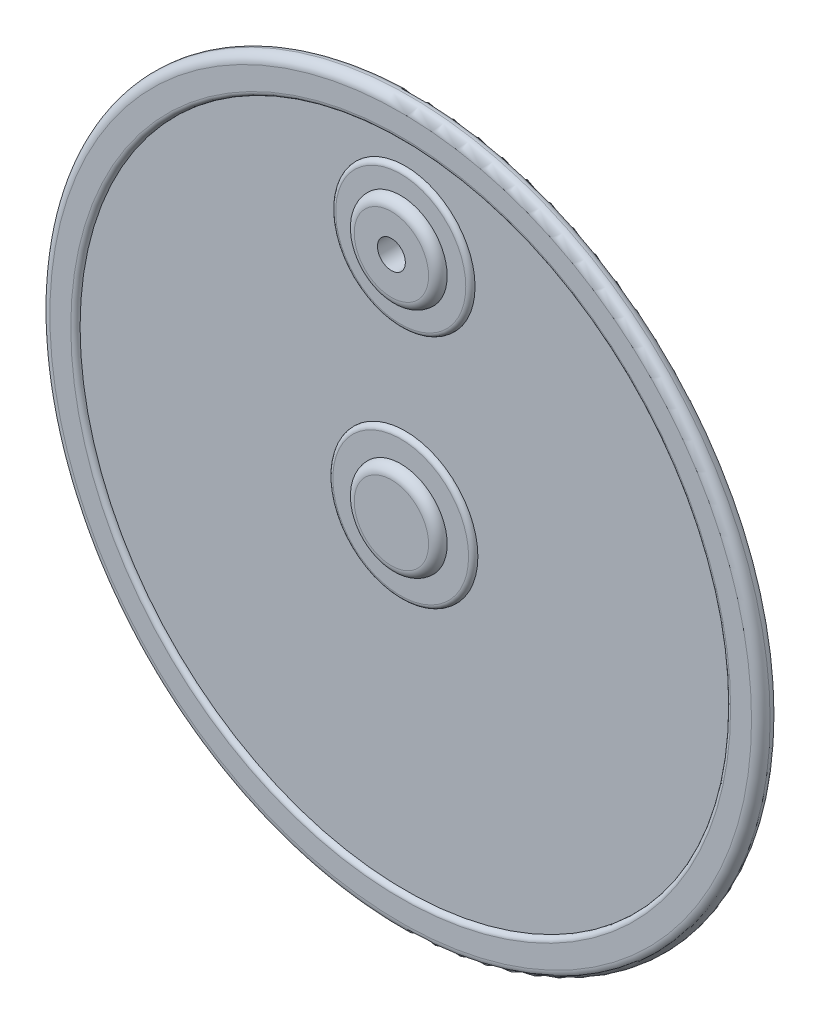
ISO-10303-21;
HEADER;
FILE_DESCRIPTION(('STEP AP214'),'2;1');
FILE_NAME('part.step','',(''),(''),'','','');
FILE_SCHEMA(('AUTOMOTIVE_DESIGN { 1 0 10303 214 1 1 1 1 }'));
ENDSEC;
DATA;
#1=APPLICATION_CONTEXT('core data for automotive mechanical design processes');
#2=APPLICATION_PROTOCOL_DEFINITION('international standard','automotive_design',2000,#1);
#3=PRODUCT_CONTEXT('',#1,'mechanical');
#4=PRODUCT('Part','Part','',(#3));
#5=PRODUCT_RELATED_PRODUCT_CATEGORY('part','',(#4));
#6=PRODUCT_DEFINITION_FORMATION('','',#4);
#7=PRODUCT_DEFINITION_CONTEXT('part definition',#1,'design');
#8=PRODUCT_DEFINITION('design','',#6,#7);
#9=PRODUCT_DEFINITION_SHAPE('','',#8);
#10=(LENGTH_UNIT() NAMED_UNIT(*) SI_UNIT(.MILLI.,.METRE.));
#11=(NAMED_UNIT(*) PLANE_ANGLE_UNIT() SI_UNIT($,.RADIAN.));
#12=(NAMED_UNIT(*) SI_UNIT($,.STERADIAN.) SOLID_ANGLE_UNIT());
#13=UNCERTAINTY_MEASURE_WITH_UNIT(LENGTH_MEASURE(1.E-05),#10,'distance_accuracy_value','');
#14=(GEOMETRIC_REPRESENTATION_CONTEXT(3) GLOBAL_UNCERTAINTY_ASSIGNED_CONTEXT((#13)) GLOBAL_UNIT_ASSIGNED_CONTEXT((#10,
#11,#12)) REPRESENTATION_CONTEXT('',''));
#15=CARTESIAN_POINT('',(0.,0.,0.));
#16=DIRECTION('',(0.,0.,1.));
#17=DIRECTION('',(1.,0.,0.));
#18=AXIS2_PLACEMENT_3D('',#15,#16,#17);
#19=CARTESIAN_POINT('',(0.,0.,4.));
#20=DIRECTION('',(0.,0.,1.));
#21=DIRECTION('',(1.,0.,0.));
#22=AXIS2_PLACEMENT_3D('',#19,#20,#21);
#23=PLANE('',#22);
#24=CARTESIAN_POINT('',(0.,50.,4.));
#25=DIRECTION('',(0.,0.,1.));
#26=DIRECTION('',(1.,0.,0.));
#27=AXIS2_PLACEMENT_3D('',#24,#25,#26);
#28=CIRCLE('',#27,14.);
#29=CARTESIAN_POINT('',(14.,50.,4.));
#30=VERTEX_POINT('',#29);
#31=EDGE_CURVE('E150',#30,#30,#28,.T.);
#32=ORIENTED_EDGE('',*,*,#31,.T.);
#33=EDGE_LOOP('',(#32));
#34=FACE_BOUND('',#33,.T.);
#35=CARTESIAN_POINT('',(0.,50.,4.));
#36=DIRECTION('',(0.,0.,1.));
#37=DIRECTION('',(1.,0.,0.));
#38=AXIS2_PLACEMENT_3D('',#35,#36,#37);
#39=CIRCLE('',#38,10.);
#40=CARTESIAN_POINT('',(10.,50.,4.));
#41=VERTEX_POINT('',#40);
#42=EDGE_CURVE('E193',#41,#41,#39,.T.);
#43=ORIENTED_EDGE('',*,*,#42,.F.);
#44=EDGE_LOOP('',(#43));
#45=FACE_BOUND('',#44,.T.);
#46=ADVANCED_FACE('F38',(#34,#45),#23,.T.);
#47=CARTESIAN_POINT('',(0.,0.,4.));
#48=DIRECTION('',(0.,0.,1.));
#49=DIRECTION('',(1.,0.,0.));
#50=AXIS2_PLACEMENT_3D('',#47,#48,#49);
#51=CIRCLE('',#50,71.);
#52=CARTESIAN_POINT('',(71.,0.,4.));
#53=VERTEX_POINT('',#52);
#54=EDGE_CURVE('E153',#53,#53,#51,.F.);
#55=ORIENTED_EDGE('',*,*,#54,.T.);
#56=EDGE_LOOP('',(#55));
#57=FACE_BOUND('',#56,.T.);
#58=CARTESIAN_POINT('',(0.,0.,4.));
#59=DIRECTION('',(0.,0.,1.));
#60=DIRECTION('',(1.,0.,0.));
#61=AXIS2_PLACEMENT_3D('',#58,#59,#60);
#62=CIRCLE('',#61,75.5);
#63=CARTESIAN_POINT('',(75.5,0.,4.));
#64=VERTEX_POINT('',#63);
#65=EDGE_CURVE('E120',#64,#64,#62,.T.);
#66=ORIENTED_EDGE('',*,*,#65,.T.);
#67=EDGE_LOOP('',(#66));
#68=FACE_BOUND('',#67,.T.);
#69=ADVANCED_FACE('F229',(#57,#68),#23,.T.);
#70=CARTESIAN_POINT('',(0.,0.,0.));
#71=DIRECTION('',(0.,0.,1.));
#72=DIRECTION('',(1.,0.,0.));
#73=AXIS2_PLACEMENT_3D('',#70,#71,#72);
#74=PLANE('',#73);
#75=CARTESIAN_POINT('',(0.,0.,0.));
#76=DIRECTION('',(0.,0.,-1.));
#77=DIRECTION('',(-1.,0.,0.));
#78=AXIS2_PLACEMENT_3D('',#75,#76,#77);
#79=CIRCLE('',#78,73.5);
#80=CARTESIAN_POINT('',(-73.5,0.,0.));
#81=VERTEX_POINT('',#80);
#82=EDGE_CURVE('E113',#81,#81,#79,.T.);
#83=ORIENTED_EDGE('',*,*,#82,.F.);
#84=EDGE_LOOP('',(#83));
#85=FACE_BOUND('',#84,.T.);
#86=CARTESIAN_POINT('',(0.,0.,0.));
#87=DIRECTION('',(0.,0.,1.));
#88=DIRECTION('',(1.,0.,0.));
#89=AXIS2_PLACEMENT_3D('',#86,#87,#88);
#90=CIRCLE('',#89,75.5);
#91=CARTESIAN_POINT('',(75.5,0.,0.));
#92=VERTEX_POINT('',#91);
#93=EDGE_CURVE('E123',#92,#92,#90,.F.);
#94=ORIENTED_EDGE('',*,*,#93,.T.);
#95=EDGE_LOOP('',(#94));
#96=FACE_BOUND('',#95,.T.);
#97=ADVANCED_FACE('F236',(#85,#96),#74,.F.);
#98=CARTESIAN_POINT('',(0.,0.,2.));
#99=DIRECTION('',(0.,0.,1.));
#100=DIRECTION('',(1.,0.,0.));
#101=AXIS2_PLACEMENT_3D('',#98,#99,#100);
#102=TOROIDAL_SURFACE('',#101,75.5,2.);
#103=ORIENTED_EDGE('',*,*,#93,.F.);
#104=EDGE_LOOP('',(#103));
#105=FACE_BOUND('',#104,.T.);
#106=CARTESIAN_POINT('',(0.,0.,2.));
#107=DIRECTION('',(0.,0.,1.));
#108=DIRECTION('',(1.,0.,0.));
#109=AXIS2_PLACEMENT_3D('',#106,#107,#108);
#110=CIRCLE('',#109,77.5);
#111=CARTESIAN_POINT('',(77.5,0.,2.));
#112=VERTEX_POINT('',#111);
#113=EDGE_CURVE('E117',#112,#112,#110,.T.);
#114=ORIENTED_EDGE('',*,*,#113,.F.);
#115=EDGE_LOOP('',(#114));
#116=FACE_BOUND('',#115,.T.);
#117=ADVANCED_FACE('F554',(#105,#116),#102,.T.);
#118=CARTESIAN_POINT('',(0.,0.,2.));
#119=DIRECTION('',(0.,0.,1.));
#120=DIRECTION('',(1.,0.,0.));
#121=AXIS2_PLACEMENT_3D('',#118,#119,#120);
#122=TOROIDAL_SURFACE('',#121,75.5,2.);
#123=ORIENTED_EDGE('',*,*,#113,.T.);
#124=EDGE_LOOP('',(#123));
#125=FACE_BOUND('',#124,.T.);
#126=ORIENTED_EDGE('',*,*,#65,.F.);
#127=EDGE_LOOP('',(#126));
#128=FACE_BOUND('',#127,.T.);
#129=ADVANCED_FACE('F546',(#125,#128),#122,.T.);
#130=CARTESIAN_POINT('',(0.,0.,2.));
#131=DIRECTION('',(0.,0.,-1.));
#132=DIRECTION('',(-1.,0.,0.));
#133=AXIS2_PLACEMENT_3D('',#130,#131,#132);
#134=CYLINDRICAL_SURFACE('',#133,73.5);
#135=CARTESIAN_POINT('',(0.,0.,2.));
#136=DIRECTION('',(0.,0.,-1.));
#137=DIRECTION('',(-1.,0.,0.));
#138=AXIS2_PLACEMENT_3D('',#135,#136,#137);
#139=CIRCLE('',#138,73.5);
#140=CARTESIAN_POINT('',(-73.5,0.,2.));
#141=VERTEX_POINT('',#140);
#142=EDGE_CURVE('E114',#141,#141,#139,.T.);
#143=ORIENTED_EDGE('',*,*,#142,.F.);
#144=EDGE_LOOP('',(#143));
#145=FACE_BOUND('',#144,.T.);
#146=ORIENTED_EDGE('',*,*,#82,.T.);
#147=EDGE_LOOP('',(#146));
#148=FACE_BOUND('',#147,.T.);
#149=ADVANCED_FACE('F540',(#145,#148),#134,.F.);
#150=CARTESIAN_POINT('',(0.,0.,2.));
#151=DIRECTION('',(0.,0.,-1.));
#152=DIRECTION('',(-1.,0.,0.));
#153=AXIS2_PLACEMENT_3D('',#150,#151,#152);
#154=PLANE('',#153);
#155=CARTESIAN_POINT('',(0.,0.,2.));
#156=DIRECTION('',(0.,0.,-1.));
#157=DIRECTION('',(-1.,0.,0.));
#158=AXIS2_PLACEMENT_3D('',#155,#156,#157);
#159=CIRCLE('',#158,69.5);
#160=CARTESIAN_POINT('',(-69.5,0.,2.));
#161=VERTEX_POINT('',#160);
#162=EDGE_CURVE('E110',#161,#161,#159,.T.);
#163=ORIENTED_EDGE('',*,*,#162,.F.);
#164=EDGE_LOOP('',(#163));
#165=FACE_BOUND('',#164,.T.);
#166=ORIENTED_EDGE('',*,*,#142,.T.);
#167=EDGE_LOOP('',(#166));
#168=FACE_BOUND('',#167,.T.);
#169=ADVANCED_FACE('F418',(#165,#168),#154,.T.);
#170=CARTESIAN_POINT('',(0.,0.,0.));
#171=DIRECTION('',(0.,0.,1.));
#172=DIRECTION('',(1.,0.,0.));
#173=AXIS2_PLACEMENT_3D('',#170,#171,#172);
#174=CIRCLE('',#173,17.);
#175=CARTESIAN_POINT('',(17.,0.,0.));
#176=VERTEX_POINT('',#175);
#177=EDGE_CURVE('E42',#176,#176,#174,.T.);
#178=ORIENTED_EDGE('',*,*,#177,.T.);
#179=EDGE_LOOP('',(#178));
#180=FACE_BOUND('',#179,.T.);
#181=DIRECTION('',(1.,0.,0.));
#182=VECTOR('',#181,1.);
#183=CARTESIAN_POINT('',(0.,64.,0.));
#184=LINE('',#183,#182);
#185=CARTESIAN_POINT('',(13.,64.,0.));
#186=VERTEX_POINT('',#185);
#187=CARTESIAN_POINT('',(-13.,64.,0.));
#188=VERTEX_POINT('',#187);
#189=EDGE_CURVE('E54',#186,#188,#184,.F.);
#190=ORIENTED_EDGE('',*,*,#189,.T.);
#191=CARTESIAN_POINT('',(-13.,50.,0.));
#192=DIRECTION('',(0.,0.,1.));
#193=DIRECTION('',(1.,0.,0.));
#194=AXIS2_PLACEMENT_3D('',#191,#192,#193);
#195=CIRCLE('',#194,14.);
#196=CARTESIAN_POINT('',(-13.,36.,0.));
#197=VERTEX_POINT('',#196);
#198=EDGE_CURVE('E85',#188,#197,#195,.T.);
#199=ORIENTED_EDGE('',*,*,#198,.T.);
#200=DIRECTION('',(-1.,0.,0.));
#201=VECTOR('',#200,1.);
#202=CARTESIAN_POINT('',(0.,36.,0.));
#203=LINE('',#202,#201);
#204=CARTESIAN_POINT('',(13.,36.,0.));
#205=VERTEX_POINT('',#204);
#206=EDGE_CURVE('E137',#197,#205,#203,.F.);
#207=ORIENTED_EDGE('',*,*,#206,.T.);
#208=CARTESIAN_POINT('',(13.,50.,0.));
#209=DIRECTION('',(0.,0.,1.));
#210=DIRECTION('',(1.,0.,0.));
#211=AXIS2_PLACEMENT_3D('',#208,#209,#210);
#212=CIRCLE('',#211,14.);
#213=EDGE_CURVE('E135',#205,#186,#212,.T.);
#214=ORIENTED_EDGE('',*,*,#213,.T.);
#215=EDGE_LOOP('',(#190,#199,#207,#214));
#216=FACE_BOUND('',#215,.T.);
#217=CARTESIAN_POINT('',(0.,0.,0.));
#218=DIRECTION('',(0.,0.,1.));
#219=DIRECTION('',(1.,0.,0.));
#220=AXIS2_PLACEMENT_3D('',#217,#218,#219);
#221=CIRCLE('',#220,67.5);
#222=CARTESIAN_POINT('',(67.5,0.,0.));
#223=VERTEX_POINT('',#222);
#224=EDGE_CURVE('E126',#223,#223,#221,.F.);
#225=ORIENTED_EDGE('',*,*,#224,.T.);
#226=EDGE_LOOP('',(#225));
#227=FACE_BOUND('',#226,.T.);
#228=ADVANCED_FACE('F162',(#180,#216,#227),#74,.F.);
#229=CARTESIAN_POINT('',(0.,0.,2.));
#230=DIRECTION('',(0.,0.,1.));
#231=DIRECTION('',(1.,0.,0.));
#232=AXIS2_PLACEMENT_3D('',#229,#230,#231);
#233=TOROIDAL_SURFACE('',#232,67.5,2.);
#234=ORIENTED_EDGE('',*,*,#162,.T.);
#235=EDGE_LOOP('',(#234));
#236=FACE_BOUND('',#235,.T.);
#237=ORIENTED_EDGE('',*,*,#224,.F.);
#238=EDGE_LOOP('',(#237));
#239=FACE_BOUND('',#238,.T.);
#240=ADVANCED_FACE('F220',(#236,#239),#233,.T.);
#241=CARTESIAN_POINT('',(-13.,50.,2.));
#242=DIRECTION('',(0.,0.,-1.));
#243=DIRECTION('',(-1.,0.,0.));
#244=AXIS2_PLACEMENT_3D('',#241,#242,#243);
#245=PLANE('',#244);
#246=CARTESIAN_POINT('',(0.,50.,2.));
#247=DIRECTION('',(0.,0.,-1.));
#248=DIRECTION('',(-1.,0.,0.));
#249=AXIS2_PLACEMENT_3D('',#246,#247,#248);
#250=CIRCLE('',#249,10.);
#251=CARTESIAN_POINT('',(-10.,50.,2.));
#252=VERTEX_POINT('',#251);
#253=EDGE_CURVE('E104',#252,#252,#250,.T.);
#254=ORIENTED_EDGE('',*,*,#253,.F.);
#255=EDGE_LOOP('',(#254));
#256=FACE_BOUND('',#255,.T.);
#257=CARTESIAN_POINT('',(-13.,50.,2.));
#258=DIRECTION('',(0.,0.,-1.));
#259=DIRECTION('',(-1.,0.,0.));
#260=AXIS2_PLACEMENT_3D('',#257,#258,#259);
#261=CIRCLE('',#260,12.);
#262=CARTESIAN_POINT('',(-13.,38.,2.));
#263=VERTEX_POINT('',#262);
#264=CARTESIAN_POINT('',(-13.,62.,2.));
#265=VERTEX_POINT('',#264);
#266=EDGE_CURVE('E84',#263,#265,#261,.T.);
#267=ORIENTED_EDGE('',*,*,#266,.T.);
#268=DIRECTION('',(1.,0.,0.));
#269=VECTOR('',#268,1.);
#270=CARTESIAN_POINT('',(-13.,62.,2.));
#271=LINE('',#270,#269);
#272=CARTESIAN_POINT('',(13.,62.,2.));
#273=VERTEX_POINT('',#272);
#274=EDGE_CURVE('E90',#265,#273,#271,.T.);
#275=ORIENTED_EDGE('',*,*,#274,.T.);
#276=CARTESIAN_POINT('',(13.,50.,2.));
#277=DIRECTION('',(0.,0.,-1.));
#278=DIRECTION('',(-1.,0.,0.));
#279=AXIS2_PLACEMENT_3D('',#276,#277,#278);
#280=CIRCLE('',#279,12.);
#281=CARTESIAN_POINT('',(13.,38.,2.));
#282=VERTEX_POINT('',#281);
#283=EDGE_CURVE('E96',#273,#282,#280,.T.);
#284=ORIENTED_EDGE('',*,*,#283,.T.);
#285=DIRECTION('',(-1.,0.,0.));
#286=VECTOR('',#285,1.);
#287=CARTESIAN_POINT('',(-13.,38.,2.));
#288=LINE('',#287,#286);
#289=EDGE_CURVE('E100',#282,#263,#288,.T.);
#290=ORIENTED_EDGE('',*,*,#289,.T.);
#291=EDGE_LOOP('',(#267,#275,#284,#290));
#292=FACE_BOUND('',#291,.T.);
#293=ADVANCED_FACE('F98',(#256,#292),#245,.T.);
#294=CARTESIAN_POINT('',(0.,50.,0.));
#295=DIRECTION('',(0.,0.,1.));
#296=DIRECTION('',(1.,0.,0.));
#297=AXIS2_PLACEMENT_3D('',#294,#295,#296);
#298=CYLINDRICAL_SURFACE('',#297,10.);
#299=CARTESIAN_POINT('',(0.,50.,0.));
#300=DIRECTION('',(0.,0.,-1.));
#301=DIRECTION('',(-1.,0.,0.));
#302=AXIS2_PLACEMENT_3D('',#299,#300,#301);
#303=CIRCLE('',#302,10.);
#304=CARTESIAN_POINT('',(-10.,50.,0.));
#305=VERTEX_POINT('',#304);
#306=EDGE_CURVE('E101',#305,#305,#303,.T.);
#307=ORIENTED_EDGE('',*,*,#306,.F.);
#308=EDGE_LOOP('',(#307));
#309=FACE_BOUND('',#308,.T.);
#310=ORIENTED_EDGE('',*,*,#253,.T.);
#311=EDGE_LOOP('',(#310));
#312=FACE_BOUND('',#311,.T.);
#313=ADVANCED_FACE('F209',(#309,#312),#298,.T.);
#314=CARTESIAN_POINT('',(0.,50.,0.));
#315=DIRECTION('',(0.,0.,-1.));
#316=DIRECTION('',(-1.,0.,0.));
#317=AXIS2_PLACEMENT_3D('',#314,#315,#316);
#318=PLANE('',#317);
#319=CARTESIAN_POINT('',(0.,50.,0.));
#320=DIRECTION('',(0.,0.,-1.));
#321=DIRECTION('',(-1.,0.,0.));
#322=AXIS2_PLACEMENT_3D('',#319,#320,#321);
#323=CIRCLE('',#322,6.);
#324=CARTESIAN_POINT('',(-6.,50.,0.));
#325=VERTEX_POINT('',#324);
#326=EDGE_CURVE('E131',#325,#325,#323,.T.);
#327=ORIENTED_EDGE('',*,*,#326,.F.);
#328=EDGE_LOOP('',(#327));
#329=FACE_BOUND('',#328,.T.);
#330=ORIENTED_EDGE('',*,*,#306,.T.);
#331=EDGE_LOOP('',(#330));
#332=FACE_BOUND('',#331,.T.);
#333=ADVANCED_FACE('F206',(#329,#332),#318,.T.);
#334=CARTESIAN_POINT('',(0.,50.,-10.));
#335=DIRECTION('',(0.,0.,1.));
#336=DIRECTION('',(1.,0.,0.));
#337=AXIS2_PLACEMENT_3D('',#334,#335,#336);
#338=CYLINDRICAL_SURFACE('',#337,6.);
#339=CARTESIAN_POINT('',(0.,50.,-10.));
#340=DIRECTION('',(0.,0.,-1.));
#341=DIRECTION('',(-1.,0.,0.));
#342=AXIS2_PLACEMENT_3D('',#339,#340,#341);
#343=CIRCLE('',#342,6.);
#344=CARTESIAN_POINT('',(-6.,50.,-10.));
#345=VERTEX_POINT('',#344);
#346=EDGE_CURVE('E198',#345,#345,#343,.T.);
#347=ORIENTED_EDGE('',*,*,#346,.F.);
#348=EDGE_LOOP('',(#347));
#349=FACE_BOUND('',#348,.T.);
#350=ORIENTED_EDGE('',*,*,#326,.T.);
#351=EDGE_LOOP('',(#350));
#352=FACE_BOUND('',#351,.T.);
#353=ADVANCED_FACE('F204',(#349,#352),#338,.T.);
#354=CARTESIAN_POINT('',(0.,50.,-10.));
#355=DIRECTION('',(0.,0.,-1.));
#356=DIRECTION('',(-1.,0.,0.));
#357=AXIS2_PLACEMENT_3D('',#354,#355,#356);
#358=PLANE('',#357);
#359=CARTESIAN_POINT('',(0.,50.,-10.));
#360=DIRECTION('',(0.,0.,-1.));
#361=DIRECTION('',(-1.,0.,0.));
#362=AXIS2_PLACEMENT_3D('',#359,#360,#361);
#363=CIRCLE('',#362,3.);
#364=CARTESIAN_POINT('',(-3.,50.,-10.));
#365=VERTEX_POINT('',#364);
#366=EDGE_CURVE('E147',#365,#365,#363,.T.);
#367=ORIENTED_EDGE('',*,*,#366,.F.);
#368=EDGE_LOOP('',(#367));
#369=FACE_BOUND('',#368,.T.);
#370=ORIENTED_EDGE('',*,*,#346,.T.);
#371=EDGE_LOOP('',(#370));
#372=FACE_BOUND('',#371,.T.);
#373=ADVANCED_FACE('F277',(#369,#372),#358,.T.);
#374=CARTESIAN_POINT('',(0.,50.,6.));
#375=DIRECTION('',(0.,0.,1.));
#376=DIRECTION('',(1.,0.,0.));
#377=AXIS2_PLACEMENT_3D('',#374,#375,#376);
#378=PLANE('',#377);
#379=CARTESIAN_POINT('',(0.,50.,6.));
#380=DIRECTION('',(0.,0.,1.));
#381=DIRECTION('',(1.,0.,0.));
#382=AXIS2_PLACEMENT_3D('',#379,#380,#381);
#383=CIRCLE('',#382,8.);
#384=CARTESIAN_POINT('',(8.,50.,6.));
#385=VERTEX_POINT('',#384);
#386=EDGE_CURVE('E132',#385,#385,#383,.T.);
#387=ORIENTED_EDGE('',*,*,#386,.T.);
#388=EDGE_LOOP('',(#387));
#389=FACE_BOUND('',#388,.T.);
#390=CARTESIAN_POINT('',(0.,50.,6.));
#391=DIRECTION('',(0.,0.,-1.));
#392=DIRECTION('',(-1.,0.,0.));
#393=AXIS2_PLACEMENT_3D('',#390,#391,#392);
#394=CIRCLE('',#393,3.);
#395=CARTESIAN_POINT('',(-3.,50.,6.));
#396=VERTEX_POINT('',#395);
#397=EDGE_CURVE('E190',#396,#396,#394,.T.);
#398=ORIENTED_EDGE('',*,*,#397,.T.);
#399=EDGE_LOOP('',(#398));
#400=FACE_BOUND('',#399,.T.);
#401=ADVANCED_FACE('F273',(#389,#400),#378,.T.);
#402=CARTESIAN_POINT('',(0.,50.,6.));
#403=DIRECTION('',(0.,0.,-1.));
#404=DIRECTION('',(-1.,0.,0.));
#405=AXIS2_PLACEMENT_3D('',#402,#403,#404);
#406=CYLINDRICAL_SURFACE('',#405,3.);
#407=ORIENTED_EDGE('',*,*,#397,.F.);
#408=EDGE_LOOP('',(#407));
#409=FACE_BOUND('',#408,.T.);
#410=ORIENTED_EDGE('',*,*,#366,.T.);
#411=EDGE_LOOP('',(#410));
#412=FACE_BOUND('',#411,.T.);
#413=ADVANCED_FACE('F269',(#409,#412),#406,.F.);
#414=CARTESIAN_POINT('',(0.,50.,4.));
#415=DIRECTION('',(0.,0.,1.));
#416=DIRECTION('',(1.,0.,0.));
#417=AXIS2_PLACEMENT_3D('',#414,#415,#416);
#418=TOROIDAL_SURFACE('',#417,8.,2.);
#419=ORIENTED_EDGE('',*,*,#42,.T.);
#420=EDGE_LOOP('',(#419));
#421=FACE_BOUND('',#420,.T.);
#422=ORIENTED_EDGE('',*,*,#386,.F.);
#423=EDGE_LOOP('',(#422));
#424=FACE_BOUND('',#423,.T.);
#425=ADVANCED_FACE('F272',(#421,#424),#418,.T.);
#426=CARTESIAN_POINT('',(13.,50.,2.));
#427=DIRECTION('',(0.,0.,1.));
#428=DIRECTION('',(1.,0.,0.));
#429=AXIS2_PLACEMENT_3D('',#426,#427,#428);
#430=TOROIDAL_SURFACE('',#429,14.,2.);
#431=CARTESIAN_POINT('',(13.,64.,2.));
#432=DIRECTION('',(-1.,0.,0.));
#433=DIRECTION('',(0.,0.,1.));
#434=AXIS2_PLACEMENT_3D('',#431,#432,#433);
#435=CIRCLE('',#434,2.);
#436=EDGE_CURVE('E93',#186,#273,#435,.T.);
#437=ORIENTED_EDGE('',*,*,#436,.F.);
#438=ORIENTED_EDGE('',*,*,#213,.F.);
#439=CARTESIAN_POINT('',(13.,36.,2.));
#440=DIRECTION('',(-1.,0.,0.));
#441=DIRECTION('',(0.,0.,1.));
#442=AXIS2_PLACEMENT_3D('',#439,#440,#441);
#443=CIRCLE('',#442,2.);
#444=EDGE_CURVE('E144',#282,#205,#443,.T.);
#445=ORIENTED_EDGE('',*,*,#444,.F.);
#446=ORIENTED_EDGE('',*,*,#283,.F.);
#447=EDGE_LOOP('',(#437,#438,#445,#446));
#448=FACE_BOUND('',#447,.T.);
#449=ADVANCED_FACE('F309',(#448),#430,.T.);
#450=CARTESIAN_POINT('',(-13.,36.,2.));
#451=DIRECTION('',(-1.,0.,0.));
#452=DIRECTION('',(0.,-1.,0.));
#453=AXIS2_PLACEMENT_3D('',#450,#451,#452);
#454=CYLINDRICAL_SURFACE('',#453,2.);
#455=ORIENTED_EDGE('',*,*,#444,.T.);
#456=ORIENTED_EDGE('',*,*,#206,.F.);
#457=CARTESIAN_POINT('',(-13.,36.,2.));
#458=DIRECTION('',(-1.,0.,0.));
#459=DIRECTION('',(0.,0.,1.));
#460=AXIS2_PLACEMENT_3D('',#457,#458,#459);
#461=CIRCLE('',#460,2.);
#462=EDGE_CURVE('E61',#263,#197,#461,.T.);
#463=ORIENTED_EDGE('',*,*,#462,.F.);
#464=ORIENTED_EDGE('',*,*,#289,.F.);
#465=EDGE_LOOP('',(#455,#456,#463,#464));
#466=FACE_BOUND('',#465,.T.);
#467=ADVANCED_FACE('F317',(#466),#454,.T.);
#468=CARTESIAN_POINT('',(-13.,64.,2.));
#469=DIRECTION('',(1.,0.,0.));
#470=DIRECTION('',(0.,1.,0.));
#471=AXIS2_PLACEMENT_3D('',#468,#469,#470);
#472=CYLINDRICAL_SURFACE('',#471,2.);
#473=ORIENTED_EDGE('',*,*,#436,.T.);
#474=ORIENTED_EDGE('',*,*,#274,.F.);
#475=CARTESIAN_POINT('',(-13.,64.,2.));
#476=DIRECTION('',(-1.,0.,0.));
#477=DIRECTION('',(0.,0.,1.));
#478=AXIS2_PLACEMENT_3D('',#475,#476,#477);
#479=CIRCLE('',#478,2.);
#480=EDGE_CURVE('E80',#188,#265,#479,.T.);
#481=ORIENTED_EDGE('',*,*,#480,.F.);
#482=ORIENTED_EDGE('',*,*,#189,.F.);
#483=EDGE_LOOP('',(#473,#474,#481,#482));
#484=FACE_BOUND('',#483,.T.);
#485=ADVANCED_FACE('F91',(#484),#472,.T.);
#486=CARTESIAN_POINT('',(-13.,50.,2.));
#487=DIRECTION('',(0.,0.,1.));
#488=DIRECTION('',(1.,0.,0.));
#489=AXIS2_PLACEMENT_3D('',#486,#487,#488);
#490=TOROIDAL_SURFACE('',#489,14.,2.);
#491=ORIENTED_EDGE('',*,*,#462,.T.);
#492=ORIENTED_EDGE('',*,*,#198,.F.);
#493=ORIENTED_EDGE('',*,*,#480,.T.);
#494=ORIENTED_EDGE('',*,*,#266,.F.);
#495=EDGE_LOOP('',(#491,#492,#493,#494));
#496=FACE_BOUND('',#495,.T.);
#497=ADVANCED_FACE('F82',(#496),#490,.T.);
#498=CARTESIAN_POINT('',(0.,0.,3.));
#499=DIRECTION('',(0.,0.,1.));
#500=DIRECTION('',(1.,0.,0.));
#501=AXIS2_PLACEMENT_3D('',#498,#499,#500);
#502=PLANE('',#501);
#503=CARTESIAN_POINT('',(0.,50.,3.));
#504=DIRECTION('',(0.,0.,1.));
#505=DIRECTION('',(1.,0.,0.));
#506=AXIS2_PLACEMENT_3D('',#503,#504,#505);
#507=CIRCLE('',#506,15.);
#508=CARTESIAN_POINT('',(15.,50.,3.));
#509=VERTEX_POINT('',#508);
#510=EDGE_CURVE('E172',#509,#509,#507,.T.);
#511=ORIENTED_EDGE('',*,*,#510,.F.);
#512=EDGE_LOOP('',(#511));
#513=FACE_BOUND('',#512,.T.);
#514=CARTESIAN_POINT('',(0.,0.,3.));
#515=DIRECTION('',(0.,0.,1.));
#516=DIRECTION('',(1.,0.,0.));
#517=AXIS2_PLACEMENT_3D('',#514,#515,#516);
#518=CIRCLE('',#517,15.6064403729346);
#519=CARTESIAN_POINT('',(15.6064403729346,0.,3.));
#520=VERTEX_POINT('',#519);
#521=EDGE_CURVE('E176',#520,#520,#518,.T.);
#522=ORIENTED_EDGE('',*,*,#521,.F.);
#523=EDGE_LOOP('',(#522));
#524=FACE_BOUND('',#523,.T.);
#525=CARTESIAN_POINT('',(0.,0.,3.));
#526=DIRECTION('',(0.,0.,1.));
#527=DIRECTION('',(1.,0.,0.));
#528=AXIS2_PLACEMENT_3D('',#525,#526,#527);
#529=CIRCLE('',#528,70.);
#530=CARTESIAN_POINT('',(70.,0.,3.));
#531=VERTEX_POINT('',#530);
#532=EDGE_CURVE('E185',#531,#531,#529,.T.);
#533=ORIENTED_EDGE('',*,*,#532,.T.);
#534=EDGE_LOOP('',(#533));
#535=FACE_BOUND('',#534,.T.);
#536=ADVANCED_FACE('F260',(#513,#524,#535),#502,.T.);
#537=CARTESIAN_POINT('',(0.,0.,6.));
#538=DIRECTION('',(0.,0.,1.));
#539=DIRECTION('',(1.,0.,0.));
#540=AXIS2_PLACEMENT_3D('',#537,#538,#539);
#541=PLANE('',#540);
#542=CARTESIAN_POINT('',(0.,0.,6.));
#543=DIRECTION('',(0.,0.,1.));
#544=DIRECTION('',(1.,0.,0.));
#545=AXIS2_PLACEMENT_3D('',#542,#543,#544);
#546=CIRCLE('',#545,8.);
#547=CARTESIAN_POINT('',(8.,0.,6.));
#548=VERTEX_POINT('',#547);
#549=EDGE_CURVE('E140',#548,#548,#546,.T.);
#550=ORIENTED_EDGE('',*,*,#549,.T.);
#551=EDGE_LOOP('',(#550));
#552=FACE_BOUND('',#551,.T.);
#553=ADVANCED_FACE('F251',(#552),#541,.T.);
#554=CARTESIAN_POINT('',(0.,0.,4.));
#555=DIRECTION('',(0.,0.,1.));
#556=DIRECTION('',(1.,0.,0.));
#557=AXIS2_PLACEMENT_3D('',#554,#555,#556);
#558=TOROIDAL_SURFACE('',#557,8.,2.);
#559=CARTESIAN_POINT('',(0.,0.,4.));
#560=DIRECTION('',(0.,0.,1.));
#561=DIRECTION('',(1.,0.,0.));
#562=AXIS2_PLACEMENT_3D('',#559,#560,#561);
#563=CIRCLE('',#562,10.);
#564=CARTESIAN_POINT('',(10.,0.,4.));
#565=VERTEX_POINT('',#564);
#566=EDGE_CURVE('E87',#565,#565,#563,.T.);
#567=ORIENTED_EDGE('',*,*,#566,.T.);
#568=EDGE_LOOP('',(#567));
#569=FACE_BOUND('',#568,.T.);
#570=ORIENTED_EDGE('',*,*,#549,.F.);
#571=EDGE_LOOP('',(#570));
#572=FACE_BOUND('',#571,.T.);
#573=ADVANCED_FACE('F243',(#569,#572),#558,.T.);
#574=CARTESIAN_POINT('',(0.,0.,4.));
#575=DIRECTION('',(0.,0.,1.));
#576=DIRECTION('',(1.,0.,0.));
#577=AXIS2_PLACEMENT_3D('',#574,#575,#576);
#578=CIRCLE('',#577,14.6064403729346);
#579=CARTESIAN_POINT('',(14.6064403729346,0.,4.));
#580=VERTEX_POINT('',#579);
#581=EDGE_CURVE('E155',#580,#580,#578,.T.);
#582=ORIENTED_EDGE('',*,*,#581,.T.);
#583=EDGE_LOOP('',(#582));
#584=FACE_BOUND('',#583,.T.);
#585=ORIENTED_EDGE('',*,*,#566,.F.);
#586=EDGE_LOOP('',(#585));
#587=FACE_BOUND('',#586,.T.);
#588=ADVANCED_FACE('F232',(#584,#587),#23,.T.);
#589=CARTESIAN_POINT('',(0.,50.,3.));
#590=DIRECTION('',(0.,0.,1.));
#591=DIRECTION('',(1.,0.,0.));
#592=AXIS2_PLACEMENT_3D('',#589,#590,#591);
#593=TOROIDAL_SURFACE('',#592,14.,1.);
#594=ORIENTED_EDGE('',*,*,#510,.T.);
#595=EDGE_LOOP('',(#594));
#596=FACE_BOUND('',#595,.T.);
#597=ORIENTED_EDGE('',*,*,#31,.F.);
#598=EDGE_LOOP('',(#597));
#599=FACE_BOUND('',#598,.T.);
#600=ADVANCED_FACE('F242',(#596,#599),#593,.T.);
#601=CARTESIAN_POINT('',(0.,0.,3.));
#602=DIRECTION('',(0.,0.,1.));
#603=DIRECTION('',(1.,0.,0.));
#604=AXIS2_PLACEMENT_3D('',#601,#602,#603);
#605=TOROIDAL_SURFACE('',#604,71.,1.);
#606=ORIENTED_EDGE('',*,*,#54,.F.);
#607=EDGE_LOOP('',(#606));
#608=FACE_BOUND('',#607,.T.);
#609=ORIENTED_EDGE('',*,*,#532,.F.);
#610=EDGE_LOOP('',(#609));
#611=FACE_BOUND('',#610,.T.);
#612=ADVANCED_FACE('F248',(#608,#611),#605,.T.);
#613=CARTESIAN_POINT('',(0.,0.,3.));
#614=DIRECTION('',(0.,0.,1.));
#615=DIRECTION('',(1.,0.,0.));
#616=AXIS2_PLACEMENT_3D('',#613,#614,#615);
#617=TOROIDAL_SURFACE('',#616,14.6064403729346,1.);
#618=ORIENTED_EDGE('',*,*,#521,.T.);
#619=EDGE_LOOP('',(#618));
#620=FACE_BOUND('',#619,.T.);
#621=ORIENTED_EDGE('',*,*,#581,.F.);
#622=EDGE_LOOP('',(#621));
#623=FACE_BOUND('',#622,.T.);
#624=ADVANCED_FACE('F377',(#620,#623),#617,.T.);
#625=CARTESIAN_POINT('',(0.,0.,2.));
#626=DIRECTION('',(0.,0.,-1.));
#627=DIRECTION('',(-1.,0.,0.));
#628=AXIS2_PLACEMENT_3D('',#625,#626,#627);
#629=PLANE('',#628);
#630=CARTESIAN_POINT('',(0.,0.,2.));
#631=DIRECTION('',(0.,0.,-1.));
#632=DIRECTION('',(-1.,0.,0.));
#633=AXIS2_PLACEMENT_3D('',#630,#631,#632);
#634=CIRCLE('',#633,10.);
#635=CARTESIAN_POINT('',(-10.,0.,2.));
#636=VERTEX_POINT('',#635);
#637=EDGE_CURVE('E179',#636,#636,#634,.T.);
#638=ORIENTED_EDGE('',*,*,#637,.F.);
#639=EDGE_LOOP('',(#638));
#640=FACE_BOUND('',#639,.T.);
#641=CARTESIAN_POINT('',(0.,0.,2.));
#642=DIRECTION('',(0.,0.,-1.));
#643=DIRECTION('',(-1.,0.,0.));
#644=AXIS2_PLACEMENT_3D('',#641,#642,#643);
#645=CIRCLE('',#644,15.);
#646=CARTESIAN_POINT('',(-15.,0.,2.));
#647=VERTEX_POINT('',#646);
#648=EDGE_CURVE('E170',#647,#647,#645,.T.);
#649=ORIENTED_EDGE('',*,*,#648,.T.);
#650=EDGE_LOOP('',(#649));
#651=FACE_BOUND('',#650,.T.);
#652=ADVANCED_FACE('F387',(#640,#651),#629,.T.);
#653=CARTESIAN_POINT('',(0.,0.,0.));
#654=DIRECTION('',(0.,0.,1.));
#655=DIRECTION('',(1.,0.,0.));
#656=AXIS2_PLACEMENT_3D('',#653,#654,#655);
#657=CYLINDRICAL_SURFACE('',#656,10.);
#658=CARTESIAN_POINT('',(0.,0.,0.));
#659=DIRECTION('',(0.,0.,-1.));
#660=DIRECTION('',(-1.,0.,0.));
#661=AXIS2_PLACEMENT_3D('',#658,#659,#660);
#662=CIRCLE('',#661,10.);
#663=CARTESIAN_POINT('',(-10.,0.,0.));
#664=VERTEX_POINT('',#663);
#665=EDGE_CURVE('E173',#664,#664,#662,.T.);
#666=ORIENTED_EDGE('',*,*,#665,.F.);
#667=EDGE_LOOP('',(#666));
#668=FACE_BOUND('',#667,.T.);
#669=ORIENTED_EDGE('',*,*,#637,.T.);
#670=EDGE_LOOP('',(#669));
#671=FACE_BOUND('',#670,.T.);
#672=ADVANCED_FACE('F396',(#668,#671),#657,.T.);
#673=CARTESIAN_POINT('',(0.,0.,0.));
#674=DIRECTION('',(0.,0.,-1.));
#675=DIRECTION('',(-1.,0.,0.));
#676=AXIS2_PLACEMENT_3D('',#673,#674,#675);
#677=PLANE('',#676);
#678=CARTESIAN_POINT('',(0.,0.,0.));
#679=DIRECTION('',(0.,0.,-1.));
#680=DIRECTION('',(-1.,0.,0.));
#681=AXIS2_PLACEMENT_3D('',#678,#679,#680);
#682=CIRCLE('',#681,4.);
#683=CARTESIAN_POINT('',(-4.,0.,0.));
#684=VERTEX_POINT('',#683);
#685=EDGE_CURVE('E11',#684,#684,#682,.T.);
#686=ORIENTED_EDGE('',*,*,#685,.F.);
#687=EDGE_LOOP('',(#686));
#688=FACE_BOUND('',#687,.T.);
#689=ORIENTED_EDGE('',*,*,#665,.T.);
#690=EDGE_LOOP('',(#689));
#691=FACE_BOUND('',#690,.T.);
#692=ADVANCED_FACE('F167',(#688,#691),#677,.T.);
#693=CARTESIAN_POINT('',(0.,0.,2.));
#694=DIRECTION('',(0.,0.,1.));
#695=DIRECTION('',(1.,0.,0.));
#696=AXIS2_PLACEMENT_3D('',#693,#694,#695);
#697=TOROIDAL_SURFACE('',#696,17.,2.);
#698=ORIENTED_EDGE('',*,*,#177,.F.);
#699=EDGE_LOOP('',(#698));
#700=FACE_BOUND('',#699,.T.);
#701=ORIENTED_EDGE('',*,*,#648,.F.);
#702=EDGE_LOOP('',(#701));
#703=FACE_BOUND('',#702,.T.);
#704=ADVANCED_FACE('F40',(#700,#703),#697,.T.);
#705=CARTESIAN_POINT('',(0.,0.,-7.));
#706=DIRECTION('',(0.,0.,1.));
#707=DIRECTION('',(1.,0.,0.));
#708=AXIS2_PLACEMENT_3D('',#705,#706,#707);
#709=CYLINDRICAL_SURFACE('',#708,4.);
#710=CARTESIAN_POINT('',(0.,0.,-7.));
#711=DIRECTION('',(0.,0.,-1.));
#712=DIRECTION('',(-1.,0.,0.));
#713=AXIS2_PLACEMENT_3D('',#710,#711,#712);
#714=CIRCLE('',#713,4.);
#715=CARTESIAN_POINT('',(-4.,0.,-7.));
#716=VERTEX_POINT('',#715);
#717=EDGE_CURVE('E463',#716,#716,#714,.T.);
#718=ORIENTED_EDGE('',*,*,#717,.F.);
#719=EDGE_LOOP('',(#718));
#720=FACE_BOUND('',#719,.T.);
#721=ORIENTED_EDGE('',*,*,#685,.T.);
#722=EDGE_LOOP('',(#721));
#723=FACE_BOUND('',#722,.T.);
#724=ADVANCED_FACE('F166',(#720,#723),#709,.T.);
#725=CARTESIAN_POINT('',(0.,0.,-7.));
#726=DIRECTION('',(0.,0.,-1.));
#727=DIRECTION('',(-1.,0.,0.));
#728=AXIS2_PLACEMENT_3D('',#725,#726,#727);
#729=PLANE('',#728);
#730=ORIENTED_EDGE('',*,*,#717,.T.);
#731=EDGE_LOOP('',(#730));
#732=FACE_BOUND('',#731,.T.);
#733=ADVANCED_FACE('F445',(#732),#729,.T.);
#734=CLOSED_SHELL('',(#46,#69,#97,#117,#129,#149,#169,#228,#240,#293,#313,#333,#353,#373,#401,
#413,#425,#449,#467,#485,#497,#536,#553,#573,#588,#600,#612,#624,#652,#672,#692,#704,#724,#733));
#735=MANIFOLD_SOLID_BREP('B2',#734);
#736=ADVANCED_BREP_SHAPE_REPRESENTATION('',(#18,#735),#14);
#737=SHAPE_DEFINITION_REPRESENTATION(#9,#736);
ENDSEC;
END-ISO-10303-21;
